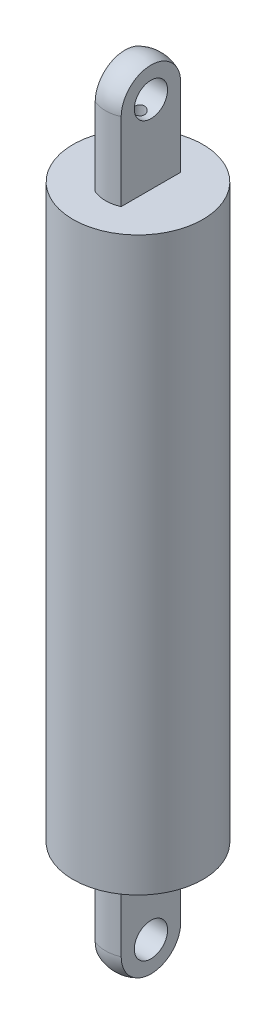
ISO-10303-21;
HEADER;
FILE_DESCRIPTION(('STEP AP214'),'2;1');
FILE_NAME('part.step','',(''),(''),'','','');
FILE_SCHEMA(('AUTOMOTIVE_DESIGN { 1 0 10303 214 1 1 1 1 }'));
ENDSEC;
DATA;
#1=APPLICATION_CONTEXT('core data for automotive mechanical design processes');
#2=APPLICATION_PROTOCOL_DEFINITION('international standard','automotive_design',2000,#1);
#3=PRODUCT_CONTEXT('',#1,'mechanical');
#4=PRODUCT('Part','Part','',(#3));
#5=PRODUCT_RELATED_PRODUCT_CATEGORY('part','',(#4));
#6=PRODUCT_DEFINITION_FORMATION('','',#4);
#7=PRODUCT_DEFINITION_CONTEXT('part definition',#1,'design');
#8=PRODUCT_DEFINITION('design','',#6,#7);
#9=PRODUCT_DEFINITION_SHAPE('','',#8);
#10=(LENGTH_UNIT() NAMED_UNIT(*) SI_UNIT(.MILLI.,.METRE.));
#11=(NAMED_UNIT(*) PLANE_ANGLE_UNIT() SI_UNIT($,.RADIAN.));
#12=(NAMED_UNIT(*) SI_UNIT($,.STERADIAN.) SOLID_ANGLE_UNIT());
#13=UNCERTAINTY_MEASURE_WITH_UNIT(LENGTH_MEASURE(1.E-05),#10,'distance_accuracy_value','');
#14=(GEOMETRIC_REPRESENTATION_CONTEXT(3) GLOBAL_UNCERTAINTY_ASSIGNED_CONTEXT((#13)) GLOBAL_UNIT_ASSIGNED_CONTEXT((#10,
#11,#12)) REPRESENTATION_CONTEXT('',''));
#15=CARTESIAN_POINT('',(0.,0.,0.));
#16=DIRECTION('',(0.,0.,1.));
#17=DIRECTION('',(1.,0.,0.));
#18=AXIS2_PLACEMENT_3D('',#15,#16,#17);
#19=CARTESIAN_POINT('',(0.,35.56,0.));
#20=DIRECTION('',(0.,1.,0.));
#21=DIRECTION('',(0.,0.,1.));
#22=AXIS2_PLACEMENT_3D('',#19,#20,#21);
#23=CYLINDRICAL_SURFACE('',#22,3.175);
#24=CARTESIAN_POINT('',(0.,-35.56,0.));
#25=DIRECTION('',(0.,1.,0.));
#26=DIRECTION('',(0.,0.,1.));
#27=AXIS2_PLACEMENT_3D('',#24,#25,#26);
#28=CIRCLE('',#27,3.175);
#29=CARTESIAN_POINT('',(1.27,-35.56,-2.90993556629696));
#30=VERTEX_POINT('',#29);
#31=CARTESIAN_POINT('',(-1.27,-35.56,-2.90993556629696));
#32=VERTEX_POINT('',#31);
#33=EDGE_CURVE('E124',#30,#32,#28,.T.);
#34=ORIENTED_EDGE('',*,*,#33,.T.);
#35=DIRECTION('',(0.,1.,0.));
#36=VECTOR('',#35,1.);
#37=CARTESIAN_POINT('',(-1.27,-38.735,-2.90993556629696));
#38=LINE('',#37,#36);
#39=CARTESIAN_POINT('',(-1.27,-27.94,-2.90993556629696));
#40=VERTEX_POINT('',#39);
#41=EDGE_CURVE('E61',#32,#40,#38,.T.);
#42=ORIENTED_EDGE('',*,*,#41,.T.);
#43=CARTESIAN_POINT('',(0.,-27.94,0.));
#44=DIRECTION('',(0.,1.,0.));
#45=DIRECTION('',(0.,0.,1.));
#46=AXIS2_PLACEMENT_3D('',#43,#44,#45);
#47=CIRCLE('',#46,3.175);
#48=CARTESIAN_POINT('',(1.27,-27.94,-2.90993556629696));
#49=VERTEX_POINT('',#48);
#50=EDGE_CURVE('E122',#49,#40,#47,.T.);
#51=ORIENTED_EDGE('',*,*,#50,.F.);
#52=DIRECTION('',(0.,1.,0.));
#53=VECTOR('',#52,1.);
#54=CARTESIAN_POINT('',(1.27,-38.735,-2.90993556629696));
#55=LINE('',#54,#53);
#56=EDGE_CURVE('E116',#30,#49,#55,.T.);
#57=ORIENTED_EDGE('',*,*,#56,.F.);
#58=EDGE_LOOP('',(#34,#42,#51,#57));
#59=FACE_BOUND('',#58,.T.);
#60=ADVANCED_FACE('F39',(#59),#23,.T.);
#61=CARTESIAN_POINT('',(-1.27,-27.94,2.90993556629695));
#62=VERTEX_POINT('',#61);
#63=CARTESIAN_POINT('',(1.27,-27.94,2.90993556629695));
#64=VERTEX_POINT('',#63);
#65=EDGE_CURVE('E131',#62,#64,#47,.T.);
#66=ORIENTED_EDGE('',*,*,#65,.F.);
#67=DIRECTION('',(0.,1.,0.));
#68=VECTOR('',#67,1.);
#69=CARTESIAN_POINT('',(-1.27,-38.735,2.90993556629695));
#70=LINE('',#69,#68);
#71=CARTESIAN_POINT('',(-1.27,-35.56,2.90993556629695));
#72=VERTEX_POINT('',#71);
#73=EDGE_CURVE('E111',#72,#62,#70,.T.);
#74=ORIENTED_EDGE('',*,*,#73,.F.);
#75=CARTESIAN_POINT('',(1.27,-35.56,2.90993556629695));
#76=VERTEX_POINT('',#75);
#77=EDGE_CURVE('E137',#72,#76,#28,.T.);
#78=ORIENTED_EDGE('',*,*,#77,.T.);
#79=DIRECTION('',(0.,1.,0.));
#80=VECTOR('',#79,1.);
#81=CARTESIAN_POINT('',(1.27,-38.735,2.90993556629695));
#82=LINE('',#81,#80);
#83=EDGE_CURVE('E68',#76,#64,#82,.T.);
#84=ORIENTED_EDGE('',*,*,#83,.T.);
#85=EDGE_LOOP('',(#66,#74,#78,#84));
#86=FACE_BOUND('',#85,.T.);
#87=ADVANCED_FACE('F195',(#86),#23,.T.);
#88=CARTESIAN_POINT('',(0.,-35.56,0.));
#89=DIRECTION('',(0.,1.,0.));
#90=DIRECTION('',(0.,0.,1.));
#91=AXIS2_PLACEMENT_3D('',#88,#89,#90);
#92=SPHERICAL_SURFACE('',#91,3.175);
#93=ORIENTED_EDGE('',*,*,#77,.F.);
#94=CARTESIAN_POINT('',(-1.27,-35.56,0.));
#95=DIRECTION('',(1.,0.,0.));
#96=DIRECTION('',(0.,0.,-1.));
#97=AXIS2_PLACEMENT_3D('',#94,#95,#96);
#98=CIRCLE('',#97,2.90993556629696);
#99=EDGE_CURVE('E11',#72,#32,#98,.T.);
#100=ORIENTED_EDGE('',*,*,#99,.T.);
#101=ORIENTED_EDGE('',*,*,#33,.F.);
#102=CARTESIAN_POINT('',(1.27,-35.56,0.));
#103=DIRECTION('',(1.,0.,0.));
#104=DIRECTION('',(0.,0.,-1.));
#105=AXIS2_PLACEMENT_3D('',#102,#103,#104);
#106=CIRCLE('',#105,2.90993556629696);
#107=EDGE_CURVE('E53',#76,#30,#106,.T.);
#108=ORIENTED_EDGE('',*,*,#107,.F.);
#109=EDGE_LOOP('',(#93,#100,#101,#108));
#110=FACE_BOUND('',#109,.T.);
#111=ADVANCED_FACE('F201',(#110),#92,.T.);
#112=CARTESIAN_POINT('',(0.,35.56,0.));
#113=DIRECTION('',(0.,1.,0.));
#114=DIRECTION('',(0.,0.,1.));
#115=AXIS2_PLACEMENT_3D('',#112,#113,#114);
#116=SPHERICAL_SURFACE('',#115,3.175);
#117=CARTESIAN_POINT('',(-1.27,35.56,0.));
#118=DIRECTION('',(-1.,0.,0.));
#119=DIRECTION('',(0.,0.,1.));
#120=AXIS2_PLACEMENT_3D('',#117,#118,#119);
#121=CIRCLE('',#120,2.90993556629696);
#122=CARTESIAN_POINT('',(-1.27,35.56,2.90993556629695));
#123=VERTEX_POINT('',#122);
#124=CARTESIAN_POINT('',(-1.27,35.56,-2.90993556629696));
#125=VERTEX_POINT('',#124);
#126=EDGE_CURVE('E246',#123,#125,#121,.T.);
#127=ORIENTED_EDGE('',*,*,#126,.F.);
#128=CARTESIAN_POINT('',(0.,35.56,0.));
#129=DIRECTION('',(0.,1.,0.));
#130=DIRECTION('',(0.,0.,1.));
#131=AXIS2_PLACEMENT_3D('',#128,#129,#130);
#132=CIRCLE('',#131,3.175);
#133=CARTESIAN_POINT('',(1.27,35.56,2.90993556629695));
#134=VERTEX_POINT('',#133);
#135=EDGE_CURVE('E146',#123,#134,#132,.T.);
#136=ORIENTED_EDGE('',*,*,#135,.T.);
#137=CARTESIAN_POINT('',(1.27,35.56,0.));
#138=DIRECTION('',(-1.,0.,0.));
#139=DIRECTION('',(0.,0.,1.));
#140=AXIS2_PLACEMENT_3D('',#137,#138,#139);
#141=CIRCLE('',#140,2.90993556629696);
#142=CARTESIAN_POINT('',(1.27,35.56,-2.90993556629696));
#143=VERTEX_POINT('',#142);
#144=EDGE_CURVE('E227',#134,#143,#141,.T.);
#145=ORIENTED_EDGE('',*,*,#144,.T.);
#146=EDGE_CURVE('E149',#143,#125,#132,.T.);
#147=ORIENTED_EDGE('',*,*,#146,.T.);
#148=EDGE_LOOP('',(#127,#136,#145,#147));
#149=FACE_BOUND('',#148,.T.);
#150=ADVANCED_FACE('F41',(#149),#116,.T.);
#151=CARTESIAN_POINT('',(0.,35.56,0.));
#152=DIRECTION('',(0.,1.,0.));
#153=DIRECTION('',(0.,0.,1.));
#154=AXIS2_PLACEMENT_3D('',#151,#152,#153);
#155=CYLINDRICAL_SURFACE('',#154,3.175);
#156=DIRECTION('',(0.,-1.,0.));
#157=VECTOR('',#156,1.);
#158=CARTESIAN_POINT('',(-1.27,38.735,2.90993556629695));
#159=LINE('',#158,#157);
#160=CARTESIAN_POINT('',(-1.27,27.94,2.90993556629695));
#161=VERTEX_POINT('',#160);
#162=EDGE_CURVE('E222',#123,#161,#159,.T.);
#163=ORIENTED_EDGE('',*,*,#162,.T.);
#164=CARTESIAN_POINT('',(0.,27.94,0.));
#165=DIRECTION('',(0.,1.,0.));
#166=DIRECTION('',(0.,0.,1.));
#167=AXIS2_PLACEMENT_3D('',#164,#165,#166);
#168=CIRCLE('',#167,3.175);
#169=CARTESIAN_POINT('',(1.27,27.94,2.90993556629695));
#170=VERTEX_POINT('',#169);
#171=EDGE_CURVE('E142',#161,#170,#168,.T.);
#172=ORIENTED_EDGE('',*,*,#171,.T.);
#173=DIRECTION('',(0.,-1.,0.));
#174=VECTOR('',#173,1.);
#175=CARTESIAN_POINT('',(1.27,38.735,2.90993556629695));
#176=LINE('',#175,#174);
#177=EDGE_CURVE('E239',#134,#170,#176,.T.);
#178=ORIENTED_EDGE('',*,*,#177,.F.);
#179=ORIENTED_EDGE('',*,*,#135,.F.);
#180=EDGE_LOOP('',(#163,#172,#178,#179));
#181=FACE_BOUND('',#180,.T.);
#182=ADVANCED_FACE('F211',(#181),#155,.T.);
#183=DIRECTION('',(0.,-1.,0.));
#184=VECTOR('',#183,1.);
#185=CARTESIAN_POINT('',(-1.27,38.735,-2.90993556629696));
#186=LINE('',#185,#184);
#187=CARTESIAN_POINT('',(-1.27,27.94,-2.90993556629696));
#188=VERTEX_POINT('',#187);
#189=EDGE_CURVE('E228',#125,#188,#186,.T.);
#190=ORIENTED_EDGE('',*,*,#189,.F.);
#191=ORIENTED_EDGE('',*,*,#146,.F.);
#192=DIRECTION('',(0.,-1.,0.));
#193=VECTOR('',#192,1.);
#194=CARTESIAN_POINT('',(1.27,38.735,-2.90993556629696));
#195=LINE('',#194,#193);
#196=CARTESIAN_POINT('',(1.27,27.94,-2.90993556629696));
#197=VERTEX_POINT('',#196);
#198=EDGE_CURVE('E237',#143,#197,#195,.T.);
#199=ORIENTED_EDGE('',*,*,#198,.T.);
#200=EDGE_CURVE('E145',#197,#188,#168,.T.);
#201=ORIENTED_EDGE('',*,*,#200,.T.);
#202=EDGE_LOOP('',(#190,#191,#199,#201));
#203=FACE_BOUND('',#202,.T.);
#204=ADVANCED_FACE('F209',(#203),#155,.T.);
#205=CARTESIAN_POINT('',(0.,27.94,3.17499999999999));
#206=DIRECTION('',(0.,-1.,0.));
#207=DIRECTION('',(0.,0.,-1.));
#208=AXIS2_PLACEMENT_3D('',#205,#206,#207);
#209=PLANE('',#208);
#210=ORIENTED_EDGE('',*,*,#200,.F.);
#211=DIRECTION('',(0.,0.,-1.));
#212=VECTOR('',#211,1.);
#213=CARTESIAN_POINT('',(1.27,27.94,0.));
#214=LINE('',#213,#212);
#215=EDGE_CURVE('E125',#170,#197,#214,.T.);
#216=ORIENTED_EDGE('',*,*,#215,.F.);
#217=ORIENTED_EDGE('',*,*,#171,.F.);
#218=DIRECTION('',(0.,0.,-1.));
#219=VECTOR('',#218,1.);
#220=CARTESIAN_POINT('',(-1.27,27.94,0.));
#221=LINE('',#220,#219);
#222=EDGE_CURVE('E232',#161,#188,#221,.T.);
#223=ORIENTED_EDGE('',*,*,#222,.T.);
#224=EDGE_LOOP('',(#210,#216,#217,#223));
#225=FACE_BOUND('',#224,.T.);
#226=CARTESIAN_POINT('',(0.,27.94,0.));
#227=DIRECTION('',(0.,1.,0.));
#228=DIRECTION('',(0.,0.,1.));
#229=AXIS2_PLACEMENT_3D('',#226,#227,#228);
#230=CIRCLE('',#229,6.35);
#231=CARTESIAN_POINT('',(0.,27.94,6.34999999999999));
#232=VERTEX_POINT('',#231);
#233=EDGE_CURVE('E134',#232,#232,#230,.T.);
#234=ORIENTED_EDGE('',*,*,#233,.T.);
#235=EDGE_LOOP('',(#234));
#236=FACE_BOUND('',#235,.T.);
#237=ADVANCED_FACE('F207',(#225,#236),#209,.F.);
#238=CARTESIAN_POINT('',(0.,35.56,0.));
#239=DIRECTION('',(0.,1.,0.));
#240=DIRECTION('',(0.,0.,1.));
#241=AXIS2_PLACEMENT_3D('',#238,#239,#240);
#242=CYLINDRICAL_SURFACE('',#241,6.35);
#243=ORIENTED_EDGE('',*,*,#233,.F.);
#244=EDGE_LOOP('',(#243));
#245=FACE_BOUND('',#244,.T.);
#246=CARTESIAN_POINT('',(0.,-27.94,0.));
#247=DIRECTION('',(0.,1.,0.));
#248=DIRECTION('',(0.,0.,1.));
#249=AXIS2_PLACEMENT_3D('',#246,#247,#248);
#250=CIRCLE('',#249,6.35);
#251=CARTESIAN_POINT('',(0.,-27.94,6.34999999999999));
#252=VERTEX_POINT('',#251);
#253=EDGE_CURVE('E130',#252,#252,#250,.T.);
#254=ORIENTED_EDGE('',*,*,#253,.T.);
#255=EDGE_LOOP('',(#254));
#256=FACE_BOUND('',#255,.T.);
#257=ADVANCED_FACE('F189',(#245,#256),#242,.T.);
#258=CARTESIAN_POINT('',(0.,-27.94,3.17499999999999));
#259=DIRECTION('',(0.,1.,0.));
#260=DIRECTION('',(0.,0.,1.));
#261=AXIS2_PLACEMENT_3D('',#258,#259,#260);
#262=PLANE('',#261);
#263=ORIENTED_EDGE('',*,*,#253,.F.);
#264=EDGE_LOOP('',(#263));
#265=FACE_BOUND('',#264,.T.);
#266=ORIENTED_EDGE('',*,*,#65,.T.);
#267=DIRECTION('',(0.,0.,-1.));
#268=VECTOR('',#267,1.);
#269=CARTESIAN_POINT('',(1.27,-27.94,0.));
#270=LINE('',#269,#268);
#271=EDGE_CURVE('E129',#64,#49,#270,.T.);
#272=ORIENTED_EDGE('',*,*,#271,.T.);
#273=ORIENTED_EDGE('',*,*,#50,.T.);
#274=DIRECTION('',(0.,0.,-1.));
#275=VECTOR('',#274,1.);
#276=CARTESIAN_POINT('',(-1.27,-27.94,0.));
#277=LINE('',#276,#275);
#278=EDGE_CURVE('E108',#62,#40,#277,.T.);
#279=ORIENTED_EDGE('',*,*,#278,.F.);
#280=EDGE_LOOP('',(#266,#272,#273,#279));
#281=FACE_BOUND('',#280,.T.);
#282=ADVANCED_FACE('F128',(#265,#281),#262,.F.);
#283=CARTESIAN_POINT('',(1.27,38.735,0.));
#284=DIRECTION('',(-1.,0.,0.));
#285=DIRECTION('',(0.,0.,1.));
#286=AXIS2_PLACEMENT_3D('',#283,#284,#285);
#287=PLANE('',#286);
#288=CARTESIAN_POINT('',(1.27,35.56,0.));
#289=DIRECTION('',(1.,0.,0.));
#290=DIRECTION('',(0.,0.,-1.));
#291=AXIS2_PLACEMENT_3D('',#288,#289,#290);
#292=CIRCLE('',#291,1.627);
#293=CARTESIAN_POINT('',(1.27,35.56,-1.62700000000001));
#294=VERTEX_POINT('',#293);
#295=EDGE_CURVE('E158',#294,#294,#292,.T.);
#296=ORIENTED_EDGE('',*,*,#295,.F.);
#297=EDGE_LOOP('',(#296));
#298=FACE_BOUND('',#297,.T.);
#299=ORIENTED_EDGE('',*,*,#177,.T.);
#300=ORIENTED_EDGE('',*,*,#215,.T.);
#301=ORIENTED_EDGE('',*,*,#198,.F.);
#302=ORIENTED_EDGE('',*,*,#144,.F.);
#303=EDGE_LOOP('',(#299,#300,#301,#302));
#304=FACE_BOUND('',#303,.T.);
#305=ADVANCED_FACE('F182',(#298,#304),#287,.F.);
#306=CARTESIAN_POINT('',(-1.27,38.735,0.));
#307=DIRECTION('',(-1.,0.,0.));
#308=DIRECTION('',(0.,0.,1.));
#309=AXIS2_PLACEMENT_3D('',#306,#307,#308);
#310=PLANE('',#309);
#311=CARTESIAN_POINT('',(-1.27,35.56,0.));
#312=DIRECTION('',(-1.,0.,0.));
#313=DIRECTION('',(0.,0.,1.));
#314=AXIS2_PLACEMENT_3D('',#311,#312,#313);
#315=CIRCLE('',#314,1.627);
#316=CARTESIAN_POINT('',(-1.27,35.56,1.62699999999999));
#317=VERTEX_POINT('',#316);
#318=EDGE_CURVE('E157',#317,#317,#315,.T.);
#319=ORIENTED_EDGE('',*,*,#318,.F.);
#320=EDGE_LOOP('',(#319));
#321=FACE_BOUND('',#320,.T.);
#322=ORIENTED_EDGE('',*,*,#126,.T.);
#323=ORIENTED_EDGE('',*,*,#189,.T.);
#324=ORIENTED_EDGE('',*,*,#222,.F.);
#325=ORIENTED_EDGE('',*,*,#162,.F.);
#326=EDGE_LOOP('',(#322,#323,#324,#325));
#327=FACE_BOUND('',#326,.T.);
#328=ADVANCED_FACE('F179',(#321,#327),#310,.T.);
#329=CARTESIAN_POINT('',(1.27,-38.735,0.));
#330=DIRECTION('',(1.,0.,0.));
#331=DIRECTION('',(0.,0.,-1.));
#332=AXIS2_PLACEMENT_3D('',#329,#330,#331);
#333=PLANE('',#332);
#334=CARTESIAN_POINT('',(1.27,-35.56,0.));
#335=DIRECTION('',(1.,0.,0.));
#336=DIRECTION('',(0.,0.,-1.));
#337=AXIS2_PLACEMENT_3D('',#334,#335,#336);
#338=CIRCLE('',#337,1.627);
#339=CARTESIAN_POINT('',(1.27,-35.56,-1.62700000000001));
#340=VERTEX_POINT('',#339);
#341=EDGE_CURVE('E277',#340,#340,#338,.T.);
#342=ORIENTED_EDGE('',*,*,#341,.F.);
#343=EDGE_LOOP('',(#342));
#344=FACE_BOUND('',#343,.T.);
#345=ORIENTED_EDGE('',*,*,#107,.T.);
#346=ORIENTED_EDGE('',*,*,#56,.T.);
#347=ORIENTED_EDGE('',*,*,#271,.F.);
#348=ORIENTED_EDGE('',*,*,#83,.F.);
#349=EDGE_LOOP('',(#345,#346,#347,#348));
#350=FACE_BOUND('',#349,.T.);
#351=ADVANCED_FACE('F175',(#344,#350),#333,.T.);
#352=CARTESIAN_POINT('',(-1.27,-38.735,0.));
#353=DIRECTION('',(1.,0.,0.));
#354=DIRECTION('',(0.,0.,-1.));
#355=AXIS2_PLACEMENT_3D('',#352,#353,#354);
#356=PLANE('',#355);
#357=CARTESIAN_POINT('',(-1.27,-35.56,0.));
#358=DIRECTION('',(1.,0.,0.));
#359=DIRECTION('',(0.,0.,-1.));
#360=AXIS2_PLACEMENT_3D('',#357,#358,#359);
#361=CIRCLE('',#360,1.627);
#362=CARTESIAN_POINT('',(-1.27,-35.56,-1.62700000000001));
#363=VERTEX_POINT('',#362);
#364=EDGE_CURVE('E270',#363,#363,#361,.T.);
#365=ORIENTED_EDGE('',*,*,#364,.T.);
#366=EDGE_LOOP('',(#365));
#367=FACE_BOUND('',#366,.T.);
#368=ORIENTED_EDGE('',*,*,#73,.T.);
#369=ORIENTED_EDGE('',*,*,#278,.T.);
#370=ORIENTED_EDGE('',*,*,#41,.F.);
#371=ORIENTED_EDGE('',*,*,#99,.F.);
#372=EDGE_LOOP('',(#368,#369,#370,#371));
#373=FACE_BOUND('',#372,.T.);
#374=ADVANCED_FACE('F109',(#367,#373),#356,.F.);
#375=CARTESIAN_POINT('',(-6.35,35.56,0.));
#376=DIRECTION('',(1.,0.,0.));
#377=DIRECTION('',(0.,0.,-1.));
#378=AXIS2_PLACEMENT_3D('',#375,#376,#377);
#379=CYLINDRICAL_SURFACE('',#378,1.627);
#380=ORIENTED_EDGE('',*,*,#318,.T.);
#381=EDGE_LOOP('',(#380));
#382=FACE_BOUND('',#381,.T.);
#383=CARTESIAN_POINT('',(0.,34.062033378209,0.634999999999992));
#384=CARTESIAN_POINT('',(-0.0341756071895739,34.0620351723678,0.635001839324021));
#385=CARTESIAN_POINT('',(-0.0683397244226081,34.0608511835887,0.632231929951332));
#386=CARTESIAN_POINT('',(-0.135631172071987,34.0562801662181,0.621281481817422));
#387=CARTESIAN_POINT('',(-0.168758595955889,34.0528933368364,0.613101432311162));
#388=CARTESIAN_POINT('',(-0.23298330200929,34.0443574907449,0.591682137368026));
#389=CARTESIAN_POINT('',(-0.264085576939568,34.0392130195811,0.578455931911289));
#390=CARTESIAN_POINT('',(-0.323642193094697,34.0277491603127,0.547366464748789));
#391=CARTESIAN_POINT('',(-0.352095669626303,34.0214293905392,0.529501695957632));
#392=CARTESIAN_POINT('',(-0.407081822193419,34.007945310168,0.488610391464089));
#393=CARTESIAN_POINT('',(-0.43345174418174,34.0007547756635,0.465373592314362));
#394=CARTESIAN_POINT('',(-0.482036572156738,33.9865571043641,0.41484293945535));
#395=CARTESIAN_POINT('',(-0.504250493980547,33.979550011346,0.38754812752647));
#396=CARTESIAN_POINT('',(-0.544695276116175,33.9661937473742,0.328422845778443));
#397=CARTESIAN_POINT('',(-0.562746687870123,33.959878860444,0.296461182283711));
#398=CARTESIAN_POINT('',(-0.593147774886063,33.9489363099161,0.22966427043901));
#399=CARTESIAN_POINT('',(-0.605499605809713,33.9443080085676,0.194830114391376));
#400=CARTESIAN_POINT('',(-0.623572449602518,33.9374464838259,0.124989854467328));
#401=CARTESIAN_POINT('',(-0.629574223015851,33.9351122067617,0.0900665292405033));
#402=CARTESIAN_POINT('',(-0.635678895009103,33.9327375117914,0.0196355584853127));
#403=CARTESIAN_POINT('',(-0.635783871906568,33.9326962857027,-0.0158718767606711));
#404=CARTESIAN_POINT('',(-0.630249654866893,33.9348497521898,-0.0844405458569179));
#405=CARTESIAN_POINT('',(-0.624917591706196,33.9369248951441,-0.117530992434519));
#406=CARTESIAN_POINT('',(-0.609180784148746,33.9429185034826,-0.182304293617839));
#407=CARTESIAN_POINT('',(-0.598775677862121,33.9468371003705,-0.213987047628644));
#408=CARTESIAN_POINT('',(-0.57305896142146,33.9562058894899,-0.275608535770084));
#409=CARTESIAN_POINT('',(-0.557676542067526,33.9616780363195,-0.305514242905016));
#410=CARTESIAN_POINT('',(-0.522506661643957,33.9736066304195,-0.362396115602885));
#411=CARTESIAN_POINT('',(-0.502717720499886,33.9800634081802,-0.389371292311177));
#412=CARTESIAN_POINT('',(-0.457845000639075,33.9937809836563,-0.441425688282832));
#413=CARTESIAN_POINT('',(-0.432506579734242,34.0010668088798,-0.46627913413458));
#414=CARTESIAN_POINT('',(-0.377986801146246,34.0153037800619,-0.511473636142813));
#415=CARTESIAN_POINT('',(-0.348804310400437,34.0222548265143,-0.531813357087642));
#416=CARTESIAN_POINT('',(-0.286462536976218,34.0352005666321,-0.567885161975139));
#417=CARTESIAN_POINT('',(-0.253220142311158,34.041165993659,-0.583484976902603));
#418=CARTESIAN_POINT('',(-0.184285518451288,34.0511241122128,-0.608777074454643));
#419=CARTESIAN_POINT('',(-0.148594804640425,34.0551180116876,-0.6184729752391));
#420=CARTESIAN_POINT('',(-0.0780213020197246,34.0603909691447,-0.63114690428257));
#421=CARTESIAN_POINT('',(-0.0432144698179259,34.0618158935882,-0.634486525907412));
#422=CARTESIAN_POINT('',(0.0264838096446987,34.0622041474884,-0.635403266735756));
#423=CARTESIAN_POINT('',(0.0613752303569782,34.0611681690918,-0.632982006228851));
#424=CARTESIAN_POINT('',(0.128306182569504,34.0569004463234,-0.622774436227281));
#425=CARTESIAN_POINT('',(0.160398755152632,34.0537882560691,-0.615279930229161));
#426=CARTESIAN_POINT('',(0.222852297905738,34.0458645171455,-0.595512632752878));
#427=CARTESIAN_POINT('',(0.253212893985932,34.0410526029547,-0.583238813436792));
#428=CARTESIAN_POINT('',(0.312673426493114,34.0300390762288,-0.553719558835788));
#429=CARTESIAN_POINT('',(0.341676532828173,34.0237901712353,-0.536297262904196));
#430=CARTESIAN_POINT('',(0.396474940198076,34.0106817384649,-0.497159269090282));
#431=CARTESIAN_POINT('',(0.422268979072803,34.0038219722385,-0.475441890548719));
#432=CARTESIAN_POINT('',(0.471783756646111,33.9896873996561,-0.426542102858491));
#433=CARTESIAN_POINT('',(0.495234800629421,33.9824169785221,-0.39908433942074));
#434=CARTESIAN_POINT('',(0.537234451638915,33.9687332685191,-0.340447433471409));
#435=CARTESIAN_POINT('',(0.555782936583529,33.9623200009965,-0.309268198317283));
#436=CARTESIAN_POINT('',(0.587359146215387,33.9510634296283,-0.244018512449136));
#437=CARTESIAN_POINT('',(0.600395782526052,33.9462175945431,-0.209952836466265));
#438=CARTESIAN_POINT('',(0.620472225148342,33.9386418067137,-0.139877564569416));
#439=CARTESIAN_POINT('',(0.627515115319235,33.9359107659461,-0.103868978461808));
#440=CARTESIAN_POINT('',(0.63505131860999,33.9329832863495,-0.0333576913000691));
#441=CARTESIAN_POINT('',(0.635926643578831,33.9326390354911,0.00109837676146182));
#442=CARTESIAN_POINT('',(0.632101341326076,33.9341301134087,0.0696478571467258));
#443=CARTESIAN_POINT('',(0.62740148442438,33.935965141075,0.103741318914932));
#444=CARTESIAN_POINT('',(0.612830732683991,33.9415370761326,0.1696172894531));
#445=CARTESIAN_POINT('',(0.603109128658899,33.9452189908198,0.201437835255071));
#446=CARTESIAN_POINT('',(0.578924375802908,33.9540948701894,0.262993854629611));
#447=CARTESIAN_POINT('',(0.564460330461815,33.9592891207427,0.292728932674597));
#448=CARTESIAN_POINT('',(0.530490090969576,33.9709566568846,0.35068821664871));
#449=CARTESIAN_POINT('',(0.51079208852933,33.9774757176602,0.378790601871026));
#450=CARTESIAN_POINT('',(0.46720702048592,33.9910011176527,0.431405512309833));
#451=CARTESIAN_POINT('',(0.443318416682775,33.9980076352233,0.455916713264169));
#452=CARTESIAN_POINT('',(0.3903801943988,34.0122226889108,0.502128433968705));
#453=CARTESIAN_POINT('',(0.361111053494798,34.0194192322637,0.523582185358022));
#454=CARTESIAN_POINT('',(0.299159063720182,34.0327521170499,0.561288024615733));
#455=CARTESIAN_POINT('',(0.266475291791793,34.0388881706111,0.577538701115849));
#456=CARTESIAN_POINT('',(0.195808637676378,34.0497233722449,0.60533988928544));
#457=CARTESIAN_POINT('',(0.157611018017682,34.0542687794565,0.616411839316287));
#458=CARTESIAN_POINT('',(0.0796028290551252,34.0604215195513,0.631237789189523));
#459=CARTESIAN_POINT('',(0.0397936255055941,34.0620312891141,0.634997858315392));
#460=CARTESIAN_POINT('',(0.,34.062033378209,0.634999999999992));
#461=B_SPLINE_CURVE_WITH_KNOTS('',3,(#383,#384,#385,#386,#387,#388,#389,#390,#391,#392,#393,
#394,#395,#396,#397,#398,#399,#400,#401,#402,#403,#404,#405,#406,#407,#408,#409,#410,#411,#412,
#413,#414,#415,#416,#417,#418,#419,#420,#421,#422,#423,#424,#425,#426,#427,#428,#429,#430,#431,
#432,#433,#434,#435,#436,#437,#438,#439,#440,#441,#442,#443,#444,#445,#446,#447,#448,#449,#450,
#451,#452,#453,#454,#455,#456,#457,#458,#459,#460),.UNSPECIFIED.,.T.,.F.,(4,2,2,2,2,2,2,2,2,2,2,
2,2,2,2,2,2,2,2,2,2,2,2,2,2,2,2,2,2,2,2,2,2,2,2,2,2,2,4),(0.,0.102378335596324,
0.204747414082879,0.306853728767649,0.408993259752757,0.516144522657904,0.62332112752202,
0.734494932449747,0.845626655346579,0.951608276878337,1.05755254510385,1.15782661237157,
1.25810783382255,1.35988351447898,1.46169343152841,1.5699032039886,1.6781449435995,
1.78917650812808,1.90013995931146,2.00457666150625,2.10898399359874,2.20784558072602,
2.30672844075435,2.40950808465339,2.51232802592635,2.62231226660414,2.73229924580765,
2.84210771033042,2.95185964277363,3.05474869970196,3.15762354215995,3.25760242329466,
3.35760021532524,3.46194379990245,3.56632576523029,3.67678573502841,3.78727564248451,
3.90658269798688,4.02579067939911),.UNSPECIFIED.);
#462=CARTESIAN_POINT('',(0.,34.062033378209,0.634999999999992));
#463=VERTEX_POINT('',#462);
#464=EDGE_CURVE('E150',#463,#463,#461,.T.);
#465=ORIENTED_EDGE('',*,*,#464,.T.);
#466=EDGE_LOOP('',(#465));
#467=FACE_BOUND('',#466,.T.);
#468=ORIENTED_EDGE('',*,*,#295,.T.);
#469=EDGE_LOOP('',(#468));
#470=FACE_BOUND('',#469,.T.);
#471=ADVANCED_FACE('F163',(#382,#467,#470),#379,.F.);
#472=CARTESIAN_POINT('',(-6.35,-35.56,0.));
#473=DIRECTION('',(1.,0.,0.));
#474=DIRECTION('',(0.,0.,-1.));
#475=AXIS2_PLACEMENT_3D('',#472,#473,#474);
#476=CYLINDRICAL_SURFACE('',#475,1.627);
#477=ORIENTED_EDGE('',*,*,#341,.T.);
#478=EDGE_LOOP('',(#477));
#479=FACE_BOUND('',#478,.T.);
#480=CARTESIAN_POINT('',(0.,-34.062033378209,0.634999999999993));
#481=CARTESIAN_POINT('',(0.0341756071895738,-34.0620351723678,0.635001839324022));
#482=CARTESIAN_POINT('',(0.0683397244226079,-34.0608511835887,0.632231929951333));
#483=CARTESIAN_POINT('',(0.135631172071987,-34.0562801662181,0.621281481817422));
#484=CARTESIAN_POINT('',(0.168758595955888,-34.0528933368364,0.613101432311162));
#485=CARTESIAN_POINT('',(0.23298330200929,-34.0443574907449,0.591682137368027));
#486=CARTESIAN_POINT('',(0.264085576939567,-34.0392130195811,0.57845593191129));
#487=CARTESIAN_POINT('',(0.323642193094697,-34.0277491603127,0.54736646474879));
#488=CARTESIAN_POINT('',(0.352095669626303,-34.0214293905392,0.529501695957633));
#489=CARTESIAN_POINT('',(0.407081822193419,-34.007945310168,0.48861039146409));
#490=CARTESIAN_POINT('',(0.43345174418174,-34.0007547756635,0.465373592314364));
#491=CARTESIAN_POINT('',(0.482036572156737,-33.9865571043641,0.414842939455351));
#492=CARTESIAN_POINT('',(0.504250493980546,-33.979550011346,0.387548127526472));
#493=CARTESIAN_POINT('',(0.544695276116174,-33.9661937473742,0.328422845778445));
#494=CARTESIAN_POINT('',(0.562746687870123,-33.959878860444,0.296461182283713));
#495=CARTESIAN_POINT('',(0.593147774886063,-33.9489363099161,0.229664270439011));
#496=CARTESIAN_POINT('',(0.605499605809713,-33.9443080085676,0.194830114391378));
#497=CARTESIAN_POINT('',(0.623572449602519,-33.9374464838259,0.12498985446733));
#498=CARTESIAN_POINT('',(0.629574223015852,-33.9351122067617,0.0900665292405051));
#499=CARTESIAN_POINT('',(0.635678895009103,-33.9327375117914,0.0196355584853148));
#500=CARTESIAN_POINT('',(0.635783871906568,-33.9326962857027,-0.0158718767606688));
#501=CARTESIAN_POINT('',(0.630249654866894,-33.9348497521898,-0.0844405458569155));
#502=CARTESIAN_POINT('',(0.624917591706197,-33.9369248951441,-0.117530992434517));
#503=CARTESIAN_POINT('',(0.609180784148748,-33.9429185034826,-0.182304293617837));
#504=CARTESIAN_POINT('',(0.598775677862122,-33.9468371003705,-0.213987047628642));
#505=CARTESIAN_POINT('',(0.573058961421461,-33.9562058894899,-0.275608535770083));
#506=CARTESIAN_POINT('',(0.557676542067528,-33.9616780363195,-0.305514242905014));
#507=CARTESIAN_POINT('',(0.522506661643959,-33.9736066304195,-0.362396115602884));
#508=CARTESIAN_POINT('',(0.502717720499888,-33.9800634081802,-0.389371292311175));
#509=CARTESIAN_POINT('',(0.457845000639077,-33.9937809836563,-0.44142568828283));
#510=CARTESIAN_POINT('',(0.432506579734244,-34.0010668088799,-0.466279134134578));
#511=CARTESIAN_POINT('',(0.377986801146249,-34.0153037800619,-0.511473636142812));
#512=CARTESIAN_POINT('',(0.34880431040044,-34.0222548265143,-0.531813357087641));
#513=CARTESIAN_POINT('',(0.28646253697622,-34.0352005666321,-0.567885161975138));
#514=CARTESIAN_POINT('',(0.253220142311161,-34.041165993659,-0.583484976902603));
#515=CARTESIAN_POINT('',(0.18428551845129,-34.0511241122128,-0.608777074454642));
#516=CARTESIAN_POINT('',(0.148594804640428,-34.0551180116876,-0.6184729752391));
#517=CARTESIAN_POINT('',(0.0780213020197277,-34.0603909691447,-0.63114690428257));
#518=CARTESIAN_POINT('',(0.0432144698179289,-34.0618158935882,-0.634486525907413));
#519=CARTESIAN_POINT('',(-0.0264838096446956,-34.0622041474884,-0.635403266735757));
#520=CARTESIAN_POINT('',(-0.061375230356975,-34.0611681690918,-0.632982006228852));
#521=CARTESIAN_POINT('',(-0.128306182569501,-34.0569004463234,-0.622774436227282));
#522=CARTESIAN_POINT('',(-0.16039875515263,-34.0537882560691,-0.615279930229163));
#523=CARTESIAN_POINT('',(-0.222852297905736,-34.0458645171455,-0.595512632752879));
#524=CARTESIAN_POINT('',(-0.25321289398593,-34.0410526029547,-0.583238813436794));
#525=CARTESIAN_POINT('',(-0.312673426493112,-34.0300390762288,-0.55371955883579));
#526=CARTESIAN_POINT('',(-0.34167653282817,-34.0237901712353,-0.536297262904198));
#527=CARTESIAN_POINT('',(-0.396474940198074,-34.0106817384649,-0.497159269090285));
#528=CARTESIAN_POINT('',(-0.422268979072801,-34.0038219722385,-0.475441890548721));
#529=CARTESIAN_POINT('',(-0.47178375664611,-33.9896873996561,-0.426542102858494));
#530=CARTESIAN_POINT('',(-0.49523480062942,-33.9824169785221,-0.399084339420743));
#531=CARTESIAN_POINT('',(-0.537234451638914,-33.9687332685191,-0.340447433471412));
#532=CARTESIAN_POINT('',(-0.555782936583528,-33.9623200009965,-0.309268198317286));
#533=CARTESIAN_POINT('',(-0.587359146215386,-33.9510634296283,-0.24401851244914));
#534=CARTESIAN_POINT('',(-0.600395782526051,-33.9462175945431,-0.20995283646627));
#535=CARTESIAN_POINT('',(-0.620472225148341,-33.9386418067137,-0.139877564569422));
#536=CARTESIAN_POINT('',(-0.627515115319235,-33.9359107659461,-0.103868978461813));
#537=CARTESIAN_POINT('',(-0.635051318609991,-33.9329832863495,-0.0333576913000733));
#538=CARTESIAN_POINT('',(-0.635926643578832,-33.9326390354911,0.00109837676145811));
#539=CARTESIAN_POINT('',(-0.632101341326077,-33.9341301134087,0.069647857146723));
#540=CARTESIAN_POINT('',(-0.627401484424381,-33.935965141075,0.10374131891493));
#541=CARTESIAN_POINT('',(-0.612830732683992,-33.9415370761326,0.169617289453098));
#542=CARTESIAN_POINT('',(-0.6031091286589,-33.9452189908198,0.201437835255069));
#543=CARTESIAN_POINT('',(-0.578924375802909,-33.9540948701894,0.262993854629609));
#544=CARTESIAN_POINT('',(-0.564460330461816,-33.9592891207427,0.292728932674595));
#545=CARTESIAN_POINT('',(-0.530490090969578,-33.9709566568846,0.350688216648707));
#546=CARTESIAN_POINT('',(-0.510792088529333,-33.9774757176602,0.378790601871023));
#547=CARTESIAN_POINT('',(-0.467207020485924,-33.9910011176527,0.431405512309831));
#548=CARTESIAN_POINT('',(-0.443318416682778,-33.9980076352233,0.455916713264167));
#549=CARTESIAN_POINT('',(-0.390380194398802,-34.0122226889108,0.502128433968704));
#550=CARTESIAN_POINT('',(-0.361111053494801,-34.0194192322637,0.52358218535802));
#551=CARTESIAN_POINT('',(-0.299159063720185,-34.0327521170499,0.561288024615732));
#552=CARTESIAN_POINT('',(-0.266475291791796,-34.0388881706111,0.577538701115848));
#553=CARTESIAN_POINT('',(-0.195808637676381,-34.0497233722449,0.60533988928544));
#554=CARTESIAN_POINT('',(-0.157611018017684,-34.0542687794565,0.616411839316287));
#555=CARTESIAN_POINT('',(-0.0796028290551256,-34.0604215195513,0.631237789189524));
#556=CARTESIAN_POINT('',(-0.0397936255055943,-34.0620312891141,0.634997858315393));
#557=CARTESIAN_POINT('',(0.,-34.062033378209,0.634999999999993));
#558=B_SPLINE_CURVE_WITH_KNOTS('',3,(#480,#481,#482,#483,#484,#485,#486,#487,#488,#489,#490,
#491,#492,#493,#494,#495,#496,#497,#498,#499,#500,#501,#502,#503,#504,#505,#506,#507,#508,#509,
#510,#511,#512,#513,#514,#515,#516,#517,#518,#519,#520,#521,#522,#523,#524,#525,#526,#527,#528,
#529,#530,#531,#532,#533,#534,#535,#536,#537,#538,#539,#540,#541,#542,#543,#544,#545,#546,#547,
#548,#549,#550,#551,#552,#553,#554,#555,#556,#557),.UNSPECIFIED.,.T.,.F.,(4,2,2,2,2,2,2,2,2,2,2,
2,2,2,2,2,2,2,2,2,2,2,2,2,2,2,2,2,2,2,2,2,2,2,2,2,2,2,4),(0.,0.102378335596324,
0.204747414082879,0.306853728767649,0.408993259752755,0.516144522657904,0.623321127522018,
0.734494932449747,0.845626655346579,0.951608276878337,1.05755254510385,1.15782661237157,
1.25810783382255,1.35988351447898,1.46169343152841,1.5699032039886,1.6781449435995,
1.78917650812808,1.90013995931146,2.00457666150625,2.10898399359874,2.20784558072602,
2.30672844075435,2.40950808465338,2.51232802592635,2.62231226660414,2.73229924580766,
2.84210771033042,2.95185964277363,3.05474869970196,3.15762354215996,3.25760242329466,
3.35760021532524,3.46194379990245,3.56632576523029,3.67678573502841,3.78727564248451,
3.90658269798689,4.02579067939911),.UNSPECIFIED.);
#559=CARTESIAN_POINT('',(0.,-34.062033378209,0.634999999999993));
#560=VERTEX_POINT('',#559);
#561=EDGE_CURVE('E43',#560,#560,#558,.T.);
#562=ORIENTED_EDGE('',*,*,#561,.T.);
#563=EDGE_LOOP('',(#562));
#564=FACE_BOUND('',#563,.T.);
#565=ORIENTED_EDGE('',*,*,#364,.F.);
#566=EDGE_LOOP('',(#565));
#567=FACE_BOUND('',#566,.T.);
#568=ADVANCED_FACE('F166',(#479,#564,#567),#476,.F.);
#569=CARTESIAN_POINT('',(0.,35.56,0.));
#570=DIRECTION('',(0.,1.,0.));
#571=DIRECTION('',(0.,0.,1.));
#572=AXIS2_PLACEMENT_3D('',#569,#570,#571);
#573=CYLINDRICAL_SURFACE('',#572,0.634999999999999);
#574=ORIENTED_EDGE('',*,*,#561,.F.);
#575=EDGE_LOOP('',(#574));
#576=FACE_BOUND('',#575,.T.);
#577=CARTESIAN_POINT('',(0.,-25.4,0.));
#578=DIRECTION('',(0.,1.,0.));
#579=DIRECTION('',(0.,0.,1.));
#580=AXIS2_PLACEMENT_3D('',#577,#578,#579);
#581=CIRCLE('',#580,0.634999999999999);
#582=CARTESIAN_POINT('',(0.,-25.4,0.634999999999992));
#583=VERTEX_POINT('',#582);
#584=EDGE_CURVE('E256',#583,#583,#581,.T.);
#585=ORIENTED_EDGE('',*,*,#584,.T.);
#586=EDGE_LOOP('',(#585));
#587=FACE_BOUND('',#586,.T.);
#588=ADVANCED_FACE('F171',(#576,#587),#573,.F.);
#589=CARTESIAN_POINT('',(0.,-25.4,3.17499999999999));
#590=DIRECTION('',(0.,1.,0.));
#591=DIRECTION('',(0.,0.,1.));
#592=AXIS2_PLACEMENT_3D('',#589,#590,#591);
#593=PLANE('',#592);
#594=CARTESIAN_POINT('',(0.,-25.4,0.));
#595=DIRECTION('',(0.,1.,0.));
#596=DIRECTION('',(0.,0.,1.));
#597=AXIS2_PLACEMENT_3D('',#594,#595,#596);
#598=CIRCLE('',#597,3.81);
#599=CARTESIAN_POINT('',(0.,-25.4,3.80999999999999));
#600=VERTEX_POINT('',#599);
#601=EDGE_CURVE('E254',#600,#600,#598,.T.);
#602=ORIENTED_EDGE('',*,*,#601,.T.);
#603=EDGE_LOOP('',(#602));
#604=FACE_BOUND('',#603,.T.);
#605=ORIENTED_EDGE('',*,*,#584,.F.);
#606=EDGE_LOOP('',(#605));
#607=FACE_BOUND('',#606,.T.);
#608=ADVANCED_FACE('F290',(#604,#607),#593,.T.);
#609=CARTESIAN_POINT('',(0.,35.56,0.));
#610=DIRECTION('',(0.,1.,0.));
#611=DIRECTION('',(0.,0.,1.));
#612=AXIS2_PLACEMENT_3D('',#609,#610,#611);
#613=CYLINDRICAL_SURFACE('',#612,3.81);
#614=CARTESIAN_POINT('',(0.,25.4,0.));
#615=DIRECTION('',(0.,1.,0.));
#616=DIRECTION('',(0.,0.,1.));
#617=AXIS2_PLACEMENT_3D('',#614,#615,#616);
#618=CIRCLE('',#617,3.81);
#619=CARTESIAN_POINT('',(0.,25.4,3.80999999999999));
#620=VERTEX_POINT('',#619);
#621=EDGE_CURVE('E251',#620,#620,#618,.T.);
#622=ORIENTED_EDGE('',*,*,#621,.T.);
#623=EDGE_LOOP('',(#622));
#624=FACE_BOUND('',#623,.T.);
#625=ORIENTED_EDGE('',*,*,#601,.F.);
#626=EDGE_LOOP('',(#625));
#627=FACE_BOUND('',#626,.T.);
#628=ADVANCED_FACE('F295',(#624,#627),#613,.F.);
#629=CARTESIAN_POINT('',(0.,25.4,3.17499999999999));
#630=DIRECTION('',(0.,-1.,0.));
#631=DIRECTION('',(0.,0.,-1.));
#632=AXIS2_PLACEMENT_3D('',#629,#630,#631);
#633=PLANE('',#632);
#634=CARTESIAN_POINT('',(0.,25.4,0.));
#635=DIRECTION('',(0.,1.,0.));
#636=DIRECTION('',(0.,0.,1.));
#637=AXIS2_PLACEMENT_3D('',#634,#635,#636);
#638=CIRCLE('',#637,0.634999999999999);
#639=CARTESIAN_POINT('',(0.,25.4,0.634999999999992));
#640=VERTEX_POINT('',#639);
#641=EDGE_CURVE('E248',#640,#640,#638,.T.);
#642=ORIENTED_EDGE('',*,*,#641,.T.);
#643=EDGE_LOOP('',(#642));
#644=FACE_BOUND('',#643,.T.);
#645=ORIENTED_EDGE('',*,*,#621,.F.);
#646=EDGE_LOOP('',(#645));
#647=FACE_BOUND('',#646,.T.);
#648=ADVANCED_FACE('F301',(#644,#647),#633,.T.);
#649=CARTESIAN_POINT('',(0.,35.56,0.));
#650=DIRECTION('',(0.,1.,0.));
#651=DIRECTION('',(0.,0.,1.));
#652=AXIS2_PLACEMENT_3D('',#649,#650,#651);
#653=CYLINDRICAL_SURFACE('',#652,0.634999999999999);
#654=ORIENTED_EDGE('',*,*,#464,.F.);
#655=EDGE_LOOP('',(#654));
#656=FACE_BOUND('',#655,.T.);
#657=ORIENTED_EDGE('',*,*,#641,.F.);
#658=EDGE_LOOP('',(#657));
#659=FACE_BOUND('',#658,.T.);
#660=ADVANCED_FACE('F159',(#656,#659),#653,.F.);
#661=CLOSED_SHELL('',(#60,#87,#111,#150,#182,#204,#237,#257,#282,#305,#328,#351,#374,#471,#568,
#588,#608,#628,#648,#660));
#662=MANIFOLD_SOLID_BREP('B2',#661);
#663=ADVANCED_BREP_SHAPE_REPRESENTATION('',(#18,#662),#14);
#664=SHAPE_DEFINITION_REPRESENTATION(#9,#663);
ENDSEC;
END-ISO-10303-21;
